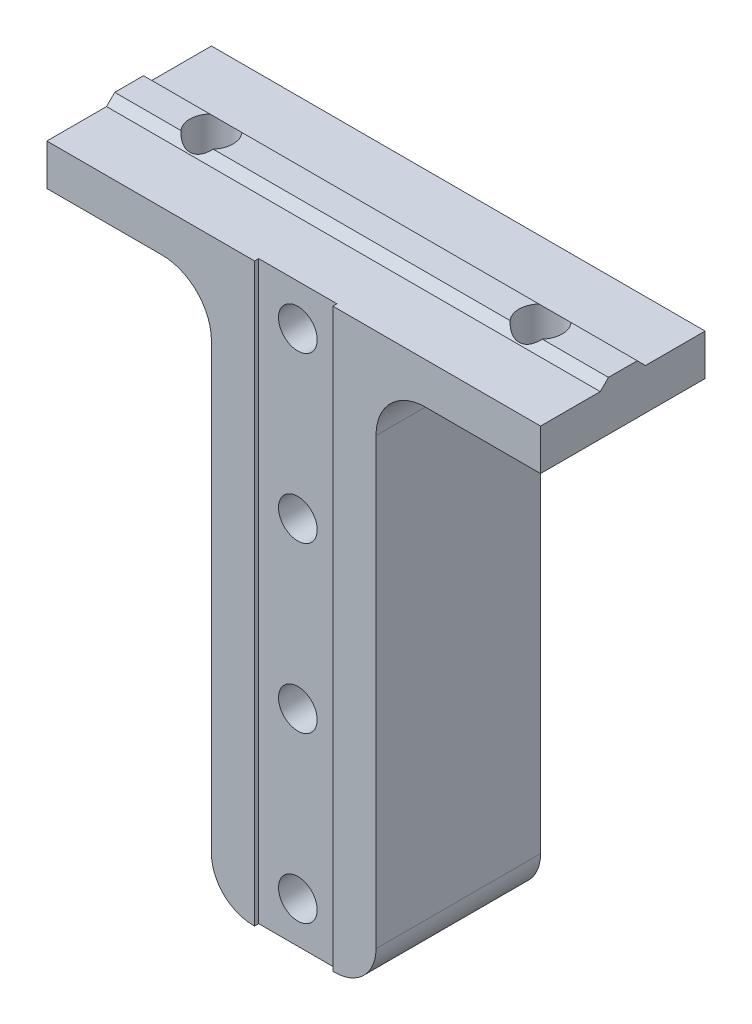
ISO-10303-21;
HEADER;
FILE_DESCRIPTION(('STEP AP214'),'2;1');
FILE_NAME('part.step','',(''),(''),'','','');
FILE_SCHEMA(('AUTOMOTIVE_DESIGN { 1 0 10303 214 1 1 1 1 }'));
ENDSEC;
DATA;
#1=APPLICATION_CONTEXT('core data for automotive mechanical design processes');
#2=APPLICATION_PROTOCOL_DEFINITION('international standard','automotive_design',2000,#1);
#3=PRODUCT_CONTEXT('',#1,'mechanical');
#4=PRODUCT('Part','Part','',(#3));
#5=PRODUCT_RELATED_PRODUCT_CATEGORY('part','',(#4));
#6=PRODUCT_DEFINITION_FORMATION('','',#4);
#7=PRODUCT_DEFINITION_CONTEXT('part definition',#1,'design');
#8=PRODUCT_DEFINITION('design','',#6,#7);
#9=PRODUCT_DEFINITION_SHAPE('','',#8);
#10=(LENGTH_UNIT() NAMED_UNIT(*) SI_UNIT(.MILLI.,.METRE.));
#11=(NAMED_UNIT(*) PLANE_ANGLE_UNIT() SI_UNIT($,.RADIAN.));
#12=(NAMED_UNIT(*) SI_UNIT($,.STERADIAN.) SOLID_ANGLE_UNIT());
#13=UNCERTAINTY_MEASURE_WITH_UNIT(LENGTH_MEASURE(1.E-05),#10,'distance_accuracy_value','');
#14=(GEOMETRIC_REPRESENTATION_CONTEXT(3) GLOBAL_UNCERTAINTY_ASSIGNED_CONTEXT((#13)) GLOBAL_UNIT_ASSIGNED_CONTEXT((#10,
#11,#12)) REPRESENTATION_CONTEXT('',''));
#15=CARTESIAN_POINT('',(0.,0.,0.));
#16=DIRECTION('',(0.,0.,1.));
#17=DIRECTION('',(1.,0.,0.));
#18=AXIS2_PLACEMENT_3D('',#15,#16,#17);
#19=CARTESIAN_POINT('',(0.,44.59375,0.));
#20=DIRECTION('',(0.,1.,0.));
#21=DIRECTION('',(0.,0.,1.));
#22=AXIS2_PLACEMENT_3D('',#19,#20,#21);
#23=PLANE('',#22);
#24=CARTESIAN_POINT('',(19.53125,44.59375,10.));
#25=DIRECTION('',(0.,-1.,0.));
#26=DIRECTION('',(0.,0.,-1.));
#27=AXIS2_PLACEMENT_3D('',#24,#25,#26);
#28=CIRCLE('',#27,2.625);
#29=CARTESIAN_POINT('',(21.4878094803123,44.59375,8.25));
#30=VERTEX_POINT('',#29);
#31=CARTESIAN_POINT('',(21.4878094803123,44.59375,11.75));
#32=VERTEX_POINT('',#31);
#33=EDGE_CURVE('E230',#30,#32,#28,.T.);
#34=ORIENTED_EDGE('',*,*,#33,.T.);
#35=DIRECTION('',(1.,0.,0.));
#36=VECTOR('',#35,1.);
#37=CARTESIAN_POINT('',(29.53125,44.59375,11.75));
#38=LINE('',#37,#36);
#39=CARTESIAN_POINT('',(29.53125,44.59375,11.75));
#40=VERTEX_POINT('',#39);
#41=EDGE_CURVE('E304',#32,#40,#38,.T.);
#42=ORIENTED_EDGE('',*,*,#41,.T.);
#43=DIRECTION('',(0.,0.,-1.));
#44=VECTOR('',#43,1.);
#45=CARTESIAN_POINT('',(29.53125,44.59375,7.25));
#46=LINE('',#45,#44);
#47=CARTESIAN_POINT('',(29.53125,44.59375,8.25));
#48=VERTEX_POINT('',#47);
#49=EDGE_CURVE('E342',#40,#48,#46,.T.);
#50=ORIENTED_EDGE('',*,*,#49,.T.);
#51=DIRECTION('',(-1.,0.,0.));
#52=VECTOR('',#51,1.);
#53=CARTESIAN_POINT('',(-30.46875,44.59375,8.25));
#54=LINE('',#53,#52);
#55=EDGE_CURVE('E235',#48,#30,#54,.T.);
#56=ORIENTED_EDGE('',*,*,#55,.T.);
#57=EDGE_LOOP('',(#34,#42,#50,#56));
#58=FACE_BOUND('',#57,.T.);
#59=ADVANCED_FACE('F46',(#58),#23,.T.);
#60=CARTESIAN_POINT('',(17.5746905196877,44.59375,11.75));
#61=VERTEX_POINT('',#60);
#62=CARTESIAN_POINT('',(17.5746905196877,44.59375,8.25));
#63=VERTEX_POINT('',#62);
#64=EDGE_CURVE('E234',#61,#63,#28,.T.);
#65=ORIENTED_EDGE('',*,*,#64,.T.);
#66=CARTESIAN_POINT('',(-18.5121905196877,44.59375,8.25));
#67=VERTEX_POINT('',#66);
#68=EDGE_CURVE('E226',#63,#67,#54,.T.);
#69=ORIENTED_EDGE('',*,*,#68,.T.);
#70=CARTESIAN_POINT('',(-20.46875,44.59375,10.));
#71=DIRECTION('',(0.,-1.,0.));
#72=DIRECTION('',(0.,0.,-1.));
#73=AXIS2_PLACEMENT_3D('',#70,#71,#72);
#74=CIRCLE('',#73,2.625);
#75=CARTESIAN_POINT('',(-18.5121905196877,44.59375,11.75));
#76=VERTEX_POINT('',#75);
#77=EDGE_CURVE('E206',#67,#76,#74,.T.);
#78=ORIENTED_EDGE('',*,*,#77,.T.);
#79=EDGE_CURVE('E310',#76,#61,#38,.T.);
#80=ORIENTED_EDGE('',*,*,#79,.T.);
#81=EDGE_LOOP('',(#65,#69,#78,#80));
#82=FACE_BOUND('',#81,.T.);
#83=ADVANCED_FACE('F233',(#82),#23,.T.);
#84=CARTESIAN_POINT('',(-10.46875,43.59375,20.));
#85=DIRECTION('',(0.,-1.,0.));
#86=DIRECTION('',(0.,0.,-1.));
#87=AXIS2_PLACEMENT_3D('',#84,#85,#86);
#88=PLANE('',#87);
#89=DIRECTION('',(-1.,0.,0.));
#90=VECTOR('',#89,1.);
#91=CARTESIAN_POINT('',(-30.46875,43.59375,7.25));
#92=LINE('',#91,#90);
#93=CARTESIAN_POINT('',(29.53125,43.59375,7.25));
#94=VERTEX_POINT('',#93);
#95=CARTESIAN_POINT('',(-30.46875,43.59375,7.25));
#96=VERTEX_POINT('',#95);
#97=EDGE_CURVE('E343',#94,#96,#92,.T.);
#98=ORIENTED_EDGE('',*,*,#97,.F.);
#99=DIRECTION('',(0.,0.,-1.));
#100=VECTOR('',#99,1.);
#101=CARTESIAN_POINT('',(29.53125,43.59375,0.));
#102=LINE('',#101,#100);
#103=CARTESIAN_POINT('',(29.53125,43.59375,0.));
#104=VERTEX_POINT('',#103);
#105=EDGE_CURVE('E358',#94,#104,#102,.T.);
#106=ORIENTED_EDGE('',*,*,#105,.T.);
#107=DIRECTION('',(-1.,0.,0.));
#108=VECTOR('',#107,1.);
#109=CARTESIAN_POINT('',(-10.46875,43.59375,0.));
#110=LINE('',#109,#108);
#111=CARTESIAN_POINT('',(-30.46875,43.59375,0.));
#112=VERTEX_POINT('',#111);
#113=EDGE_CURVE('E280',#104,#112,#110,.T.);
#114=ORIENTED_EDGE('',*,*,#113,.T.);
#115=DIRECTION('',(0.,0.,1.));
#116=VECTOR('',#115,1.);
#117=CARTESIAN_POINT('',(-30.46875,43.59375,0.));
#118=LINE('',#117,#116);
#119=EDGE_CURVE('E355',#112,#96,#118,.T.);
#120=ORIENTED_EDGE('',*,*,#119,.T.);
#121=EDGE_LOOP('',(#98,#106,#114,#120));
#122=FACE_BOUND('',#121,.T.);
#123=ADVANCED_FACE('F481',(#122),#88,.F.);
#124=DIRECTION('',(1.,0.,0.));
#125=VECTOR('',#124,1.);
#126=CARTESIAN_POINT('',(-30.46875,43.59375,12.75));
#127=LINE('',#126,#125);
#128=CARTESIAN_POINT('',(-30.46875,43.59375,12.75));
#129=VERTEX_POINT('',#128);
#130=CARTESIAN_POINT('',(29.53125,43.59375,12.75));
#131=VERTEX_POINT('',#130);
#132=EDGE_CURVE('E340',#129,#131,#127,.T.);
#133=ORIENTED_EDGE('',*,*,#132,.F.);
#134=CARTESIAN_POINT('',(-30.46875,43.59375,20.));
#135=VERTEX_POINT('',#134);
#136=EDGE_CURVE('E359',#129,#135,#118,.T.);
#137=ORIENTED_EDGE('',*,*,#136,.T.);
#138=DIRECTION('',(-1.,0.,0.));
#139=VECTOR('',#138,1.);
#140=CARTESIAN_POINT('',(-10.46875,43.59375,20.));
#141=LINE('',#140,#139);
#142=CARTESIAN_POINT('',(-5.21875,43.59375,20.));
#143=VERTEX_POINT('',#142);
#144=EDGE_CURVE('E438',#143,#135,#141,.T.);
#145=ORIENTED_EDGE('',*,*,#144,.F.);
#146=DIRECTION('',(0.,0.,1.));
#147=VECTOR('',#146,1.);
#148=CARTESIAN_POINT('',(-5.21875,43.59375,19.5));
#149=LINE('',#148,#147);
#150=CARTESIAN_POINT('',(-5.21875,43.59375,19.5));
#151=VERTEX_POINT('',#150);
#152=EDGE_CURVE('E424',#151,#143,#149,.T.);
#153=ORIENTED_EDGE('',*,*,#152,.F.);
#154=DIRECTION('',(-1.,0.,0.));
#155=VECTOR('',#154,1.);
#156=CARTESIAN_POINT('',(-5.21875,43.59375,19.5));
#157=LINE('',#156,#155);
#158=CARTESIAN_POINT('',(4.28125,43.59375,19.5));
#159=VERTEX_POINT('',#158);
#160=EDGE_CURVE('E417',#159,#151,#157,.T.);
#161=ORIENTED_EDGE('',*,*,#160,.F.);
#162=DIRECTION('',(0.,0.,1.));
#163=VECTOR('',#162,1.);
#164=CARTESIAN_POINT('',(4.28125,43.59375,19.5));
#165=LINE('',#164,#163);
#166=CARTESIAN_POINT('',(4.28125,43.59375,20.));
#167=VERTEX_POINT('',#166);
#168=EDGE_CURVE('E426',#159,#167,#165,.T.);
#169=ORIENTED_EDGE('',*,*,#168,.T.);
#170=CARTESIAN_POINT('',(29.53125,43.59375,20.));
#171=VERTEX_POINT('',#170);
#172=EDGE_CURVE('E292',#171,#167,#141,.T.);
#173=ORIENTED_EDGE('',*,*,#172,.F.);
#174=EDGE_CURVE('E369',#171,#131,#102,.T.);
#175=ORIENTED_EDGE('',*,*,#174,.T.);
#176=EDGE_LOOP('',(#133,#137,#145,#153,#161,#169,#173,#175));
#177=FACE_BOUND('',#176,.T.);
#178=ADVANCED_FACE('F464',(#177),#88,.F.);
#179=CARTESIAN_POINT('',(0.,0.,20.));
#180=DIRECTION('',(0.,0.,1.));
#181=DIRECTION('',(1.,0.,0.));
#182=AXIS2_PLACEMENT_3D('',#179,#180,#181);
#183=PLANE('',#182);
#184=DIRECTION('',(0.,-1.,0.));
#185=VECTOR('',#184,1.);
#186=CARTESIAN_POINT('',(-10.46875,43.59375,20.));
#187=LINE('',#186,#185);
#188=CARTESIAN_POINT('',(-10.46875,32.59375,20.));
#189=VERTEX_POINT('',#188);
#190=CARTESIAN_POINT('',(-10.46875,-21.40625,20.));
#191=VERTEX_POINT('',#190);
#192=EDGE_CURVE('E283',#189,#191,#187,.T.);
#193=ORIENTED_EDGE('',*,*,#192,.T.);
#194=CARTESIAN_POINT('',(-5.46875,-21.40625,20.));
#195=DIRECTION('',(0.,0.,1.));
#196=DIRECTION('',(1.,0.,0.));
#197=AXIS2_PLACEMENT_3D('',#194,#195,#196);
#198=CIRCLE('',#197,5.);
#199=CARTESIAN_POINT('',(-5.46875,-26.40625,20.));
#200=VERTEX_POINT('',#199);
#201=EDGE_CURVE('E260',#191,#200,#198,.T.);
#202=ORIENTED_EDGE('',*,*,#201,.T.);
#203=DIRECTION('',(1.,0.,0.));
#204=VECTOR('',#203,1.);
#205=CARTESIAN_POINT('',(-10.46875,-26.40625,20.));
#206=LINE('',#205,#204);
#207=CARTESIAN_POINT('',(-5.21874999999999,-26.40625,20.));
#208=VERTEX_POINT('',#207);
#209=EDGE_CURVE('E435',#200,#208,#206,.T.);
#210=ORIENTED_EDGE('',*,*,#209,.T.);
#211=DIRECTION('',(0.,-1.,0.));
#212=VECTOR('',#211,1.);
#213=CARTESIAN_POINT('',(-5.21875,43.59375,20.));
#214=LINE('',#213,#212);
#215=EDGE_CURVE('E404',#143,#208,#214,.T.);
#216=ORIENTED_EDGE('',*,*,#215,.F.);
#217=ORIENTED_EDGE('',*,*,#144,.T.);
#218=DIRECTION('',(0.,1.,0.));
#219=VECTOR('',#218,1.);
#220=CARTESIAN_POINT('',(-30.46875,38.59375,20.));
#221=LINE('',#220,#219);
#222=CARTESIAN_POINT('',(-30.46875,38.59375,20.));
#223=VERTEX_POINT('',#222);
#224=EDGE_CURVE('E345',#223,#135,#221,.T.);
#225=ORIENTED_EDGE('',*,*,#224,.F.);
#226=DIRECTION('',(1.,0.,0.));
#227=VECTOR('',#226,1.);
#228=CARTESIAN_POINT('',(-10.46875,38.59375,20.));
#229=LINE('',#228,#227);
#230=CARTESIAN_POINT('',(-16.46875,38.59375,20.));
#231=VERTEX_POINT('',#230);
#232=EDGE_CURVE('E352',#223,#231,#229,.T.);
#233=ORIENTED_EDGE('',*,*,#232,.T.);
#234=CARTESIAN_POINT('',(-16.46875,32.59375,20.));
#235=DIRECTION('',(0.,0.,1.));
#236=DIRECTION('',(1.,0.,0.));
#237=AXIS2_PLACEMENT_3D('',#234,#235,#236);
#238=CIRCLE('',#237,6.);
#239=EDGE_CURVE('E303',#231,#189,#238,.F.);
#240=ORIENTED_EDGE('',*,*,#239,.T.);
#241=EDGE_LOOP('',(#193,#202,#210,#216,#217,#225,#233,#240));
#242=FACE_BOUND('',#241,.T.);
#243=ADVANCED_FACE('F451',(#242),#183,.T.);
#244=CARTESIAN_POINT('',(-10.46875,43.59375,20.));
#245=DIRECTION('',(1.,0.,0.));
#246=DIRECTION('',(0.,1.,0.));
#247=AXIS2_PLACEMENT_3D('',#244,#245,#246);
#248=PLANE('',#247);
#249=DIRECTION('',(0.,-1.,0.));
#250=VECTOR('',#249,1.);
#251=CARTESIAN_POINT('',(-10.46875,43.59375,0.));
#252=LINE('',#251,#250);
#253=CARTESIAN_POINT('',(-10.46875,32.59375,0.));
#254=VERTEX_POINT('',#253);
#255=CARTESIAN_POINT('',(-10.46875,-21.40625,0.));
#256=VERTEX_POINT('',#255);
#257=EDGE_CURVE('E285',#254,#256,#252,.T.);
#258=ORIENTED_EDGE('',*,*,#257,.T.);
#259=DIRECTION('',(0.,0.,-1.));
#260=VECTOR('',#259,1.);
#261=CARTESIAN_POINT('',(-10.46875,-21.40625,20.));
#262=LINE('',#261,#260);
#263=EDGE_CURVE('E258',#256,#191,#262,.F.);
#264=ORIENTED_EDGE('',*,*,#263,.T.);
#265=ORIENTED_EDGE('',*,*,#192,.F.);
#266=DIRECTION('',(0.,0.,-1.));
#267=VECTOR('',#266,1.);
#268=CARTESIAN_POINT('',(-10.46875,32.59375,20.));
#269=LINE('',#268,#267);
#270=EDGE_CURVE('E297',#189,#254,#269,.T.);
#271=ORIENTED_EDGE('',*,*,#270,.T.);
#272=EDGE_LOOP('',(#258,#264,#265,#271));
#273=FACE_BOUND('',#272,.T.);
#274=ADVANCED_FACE('F444',(#273),#248,.F.);
#275=CARTESIAN_POINT('',(-10.46875,-26.40625,20.));
#276=DIRECTION('',(0.,1.,0.));
#277=DIRECTION('',(0.,0.,1.));
#278=AXIS2_PLACEMENT_3D('',#275,#276,#277);
#279=PLANE('',#278);
#280=DIRECTION('',(1.,0.,0.));
#281=VECTOR('',#280,1.);
#282=CARTESIAN_POINT('',(-10.46875,-26.40625,0.));
#283=LINE('',#282,#281);
#284=CARTESIAN_POINT('',(-5.46875,-26.40625,0.));
#285=VERTEX_POINT('',#284);
#286=CARTESIAN_POINT('',(4.53125,-26.40625,0.));
#287=VERTEX_POINT('',#286);
#288=EDGE_CURVE('E281',#285,#287,#283,.T.);
#289=ORIENTED_EDGE('',*,*,#288,.T.);
#290=DIRECTION('',(0.,0.,-1.));
#291=VECTOR('',#290,1.);
#292=CARTESIAN_POINT('',(4.53125,-26.40625,20.));
#293=LINE('',#292,#291);
#294=CARTESIAN_POINT('',(4.53125,-26.40625,20.));
#295=VERTEX_POINT('',#294);
#296=EDGE_CURVE('E54',#287,#295,#293,.F.);
#297=ORIENTED_EDGE('',*,*,#296,.T.);
#298=CARTESIAN_POINT('',(4.28125000000001,-26.40625,20.));
#299=VERTEX_POINT('',#298);
#300=EDGE_CURVE('E434',#299,#295,#206,.T.);
#301=ORIENTED_EDGE('',*,*,#300,.F.);
#302=DIRECTION('',(0.,0.,1.));
#303=VECTOR('',#302,1.);
#304=CARTESIAN_POINT('',(4.28125000000001,-26.40625,19.5));
#305=LINE('',#304,#303);
#306=CARTESIAN_POINT('',(4.28125000000001,-26.40625,19.5));
#307=VERTEX_POINT('',#306);
#308=EDGE_CURVE('E429',#307,#299,#305,.T.);
#309=ORIENTED_EDGE('',*,*,#308,.F.);
#310=DIRECTION('',(1.,0.,0.));
#311=VECTOR('',#310,1.);
#312=CARTESIAN_POINT('',(-5.21874999999999,-26.40625,19.5));
#313=LINE('',#312,#311);
#314=CARTESIAN_POINT('',(-5.21874999999999,-26.40625,19.5));
#315=VERTEX_POINT('',#314);
#316=EDGE_CURVE('E410',#315,#307,#313,.T.);
#317=ORIENTED_EDGE('',*,*,#316,.F.);
#318=DIRECTION('',(0.,0.,1.));
#319=VECTOR('',#318,1.);
#320=CARTESIAN_POINT('',(-5.21874999999999,-26.40625,19.5));
#321=LINE('',#320,#319);
#322=EDGE_CURVE('E420',#315,#208,#321,.T.);
#323=ORIENTED_EDGE('',*,*,#322,.T.);
#324=ORIENTED_EDGE('',*,*,#209,.F.);
#325=DIRECTION('',(0.,0.,-1.));
#326=VECTOR('',#325,1.);
#327=CARTESIAN_POINT('',(-5.46875,-26.40625,20.));
#328=LINE('',#327,#326);
#329=EDGE_CURVE('E253',#200,#285,#328,.T.);
#330=ORIENTED_EDGE('',*,*,#329,.T.);
#331=EDGE_LOOP('',(#289,#297,#301,#309,#317,#323,#324,#330));
#332=FACE_BOUND('',#331,.T.);
#333=ADVANCED_FACE('F453',(#332),#279,.F.);
#334=CARTESIAN_POINT('',(9.53125,43.59375,20.));
#335=DIRECTION('',(-1.,0.,0.));
#336=DIRECTION('',(0.,-1.,0.));
#337=AXIS2_PLACEMENT_3D('',#334,#335,#336);
#338=PLANE('',#337);
#339=DIRECTION('',(0.,1.,0.));
#340=VECTOR('',#339,1.);
#341=CARTESIAN_POINT('',(9.53125,43.59375,20.));
#342=LINE('',#341,#340);
#343=CARTESIAN_POINT('',(9.53125000000001,-21.40625,20.));
#344=VERTEX_POINT('',#343);
#345=CARTESIAN_POINT('',(9.53125,32.59375,20.));
#346=VERTEX_POINT('',#345);
#347=EDGE_CURVE('E272',#344,#346,#342,.T.);
#348=ORIENTED_EDGE('',*,*,#347,.F.);
#349=DIRECTION('',(0.,0.,-1.));
#350=VECTOR('',#349,1.);
#351=CARTESIAN_POINT('',(9.53125000000001,-21.40625,20.));
#352=LINE('',#351,#350);
#353=CARTESIAN_POINT('',(9.53125000000001,-21.40625,0.));
#354=VERTEX_POINT('',#353);
#355=EDGE_CURVE('E262',#344,#354,#352,.T.);
#356=ORIENTED_EDGE('',*,*,#355,.T.);
#357=DIRECTION('',(0.,1.,0.));
#358=VECTOR('',#357,1.);
#359=CARTESIAN_POINT('',(9.53125,43.59375,0.));
#360=LINE('',#359,#358);
#361=CARTESIAN_POINT('',(9.53125,32.59375,0.));
#362=VERTEX_POINT('',#361);
#363=EDGE_CURVE('E270',#354,#362,#360,.T.);
#364=ORIENTED_EDGE('',*,*,#363,.T.);
#365=DIRECTION('',(0.,0.,1.));
#366=VECTOR('',#365,1.);
#367=CARTESIAN_POINT('',(9.53125,32.59375,20.));
#368=LINE('',#367,#366);
#369=EDGE_CURVE('E289',#362,#346,#368,.T.);
#370=ORIENTED_EDGE('',*,*,#369,.T.);
#371=EDGE_LOOP('',(#348,#356,#364,#370));
#372=FACE_BOUND('',#371,.T.);
#373=ADVANCED_FACE('F268',(#372),#338,.F.);
#374=ORIENTED_EDGE('',*,*,#300,.T.);
#375=CARTESIAN_POINT('',(4.53125,-21.40625,20.));
#376=DIRECTION('',(0.,0.,1.));
#377=DIRECTION('',(1.,0.,0.));
#378=AXIS2_PLACEMENT_3D('',#375,#376,#377);
#379=CIRCLE('',#378,5.);
#380=EDGE_CURVE('E11',#295,#344,#379,.T.);
#381=ORIENTED_EDGE('',*,*,#380,.T.);
#382=ORIENTED_EDGE('',*,*,#347,.T.);
#383=CARTESIAN_POINT('',(15.53125,32.59375,20.));
#384=DIRECTION('',(0.,0.,1.));
#385=DIRECTION('',(1.,0.,0.));
#386=AXIS2_PLACEMENT_3D('',#383,#384,#385);
#387=CIRCLE('',#386,6.);
#388=CARTESIAN_POINT('',(15.53125,38.59375,20.));
#389=VERTEX_POINT('',#388);
#390=EDGE_CURVE('E294',#346,#389,#387,.F.);
#391=ORIENTED_EDGE('',*,*,#390,.T.);
#392=DIRECTION('',(1.,0.,0.));
#393=VECTOR('',#392,1.);
#394=CARTESIAN_POINT('',(9.53125,38.59375,20.));
#395=LINE('',#394,#393);
#396=CARTESIAN_POINT('',(29.53125,38.59375,20.));
#397=VERTEX_POINT('',#396);
#398=EDGE_CURVE('E366',#389,#397,#395,.T.);
#399=ORIENTED_EDGE('',*,*,#398,.T.);
#400=DIRECTION('',(0.,1.,0.));
#401=VECTOR('',#400,1.);
#402=CARTESIAN_POINT('',(29.53125,38.59375,20.));
#403=LINE('',#402,#401);
#404=EDGE_CURVE('E374',#397,#171,#403,.T.);
#405=ORIENTED_EDGE('',*,*,#404,.T.);
#406=ORIENTED_EDGE('',*,*,#172,.T.);
#407=DIRECTION('',(0.,1.,0.));
#408=VECTOR('',#407,1.);
#409=CARTESIAN_POINT('',(4.28125,43.59375,20.));
#410=LINE('',#409,#408);
#411=EDGE_CURVE('E411',#299,#167,#410,.T.);
#412=ORIENTED_EDGE('',*,*,#411,.F.);
#413=EDGE_LOOP('',(#374,#381,#382,#391,#399,#405,#406,#412));
#414=FACE_BOUND('',#413,.T.);
#415=ADVANCED_FACE('F497',(#414),#183,.T.);
#416=CARTESIAN_POINT('',(0.,0.,0.));
#417=DIRECTION('',(0.,0.,1.));
#418=DIRECTION('',(1.,0.,0.));
#419=AXIS2_PLACEMENT_3D('',#416,#417,#418);
#420=PLANE('',#419);
#421=ORIENTED_EDGE('',*,*,#363,.F.);
#422=CARTESIAN_POINT('',(4.53125,-21.40625,0.));
#423=DIRECTION('',(0.,0.,1.));
#424=DIRECTION('',(1.,0.,0.));
#425=AXIS2_PLACEMENT_3D('',#422,#423,#424);
#426=CIRCLE('',#425,5.);
#427=EDGE_CURVE('E68',#354,#287,#426,.F.);
#428=ORIENTED_EDGE('',*,*,#427,.T.);
#429=ORIENTED_EDGE('',*,*,#288,.F.);
#430=CARTESIAN_POINT('',(-5.46875,-21.40625,0.));
#431=DIRECTION('',(0.,0.,1.));
#432=DIRECTION('',(1.,0.,0.));
#433=AXIS2_PLACEMENT_3D('',#430,#431,#432);
#434=CIRCLE('',#433,5.);
#435=EDGE_CURVE('E256',#285,#256,#434,.F.);
#436=ORIENTED_EDGE('',*,*,#435,.T.);
#437=ORIENTED_EDGE('',*,*,#257,.F.);
#438=CARTESIAN_POINT('',(-16.46875,32.59375,0.));
#439=DIRECTION('',(0.,0.,1.));
#440=DIRECTION('',(1.,0.,0.));
#441=AXIS2_PLACEMENT_3D('',#438,#439,#440);
#442=CIRCLE('',#441,6.);
#443=CARTESIAN_POINT('',(-16.46875,38.59375,0.));
#444=VERTEX_POINT('',#443);
#445=EDGE_CURVE('E302',#254,#444,#442,.T.);
#446=ORIENTED_EDGE('',*,*,#445,.T.);
#447=DIRECTION('',(-1.,0.,0.));
#448=VECTOR('',#447,1.);
#449=CARTESIAN_POINT('',(-10.46875,38.59375,0.));
#450=LINE('',#449,#448);
#451=CARTESIAN_POINT('',(-30.46875,38.59375,0.));
#452=VERTEX_POINT('',#451);
#453=EDGE_CURVE('E364',#444,#452,#450,.T.);
#454=ORIENTED_EDGE('',*,*,#453,.T.);
#455=DIRECTION('',(0.,1.,0.));
#456=VECTOR('',#455,1.);
#457=CARTESIAN_POINT('',(-30.46875,38.59375,0.));
#458=LINE('',#457,#456);
#459=EDGE_CURVE('E349',#452,#112,#458,.T.);
#460=ORIENTED_EDGE('',*,*,#459,.T.);
#461=ORIENTED_EDGE('',*,*,#113,.F.);
#462=DIRECTION('',(0.,1.,0.));
#463=VECTOR('',#462,1.);
#464=CARTESIAN_POINT('',(29.53125,38.59375,0.));
#465=LINE('',#464,#463);
#466=CARTESIAN_POINT('',(29.53125,38.59375,0.));
#467=VERTEX_POINT('',#466);
#468=EDGE_CURVE('E377',#467,#104,#465,.T.);
#469=ORIENTED_EDGE('',*,*,#468,.F.);
#470=DIRECTION('',(-1.,0.,0.));
#471=VECTOR('',#470,1.);
#472=CARTESIAN_POINT('',(9.53125,38.59375,0.));
#473=LINE('',#472,#471);
#474=CARTESIAN_POINT('',(15.53125,38.59375,0.));
#475=VERTEX_POINT('',#474);
#476=EDGE_CURVE('E372',#467,#475,#473,.T.);
#477=ORIENTED_EDGE('',*,*,#476,.T.);
#478=CARTESIAN_POINT('',(15.53125,32.59375,0.));
#479=DIRECTION('',(0.,0.,1.));
#480=DIRECTION('',(1.,0.,0.));
#481=AXIS2_PLACEMENT_3D('',#478,#479,#480);
#482=CIRCLE('',#481,6.);
#483=EDGE_CURVE('E278',#475,#362,#482,.T.);
#484=ORIENTED_EDGE('',*,*,#483,.T.);
#485=EDGE_LOOP('',(#421,#428,#429,#436,#437,#446,#454,#460,#461,#469,#477,#484));
#486=FACE_BOUND('',#485,.T.);
#487=ADVANCED_FACE('F275',(#486),#420,.F.);
#488=CARTESIAN_POINT('',(-5.21875,43.59375,19.5));
#489=DIRECTION('',(-1.,0.,0.));
#490=DIRECTION('',(0.,-1.,0.));
#491=AXIS2_PLACEMENT_3D('',#488,#489,#490);
#492=PLANE('',#491);
#493=ORIENTED_EDGE('',*,*,#215,.T.);
#494=ORIENTED_EDGE('',*,*,#322,.F.);
#495=DIRECTION('',(0.,-1.,0.));
#496=VECTOR('',#495,1.);
#497=CARTESIAN_POINT('',(-5.21875,43.59375,19.5));
#498=LINE('',#497,#496);
#499=EDGE_CURVE('E407',#151,#315,#498,.T.);
#500=ORIENTED_EDGE('',*,*,#499,.F.);
#501=ORIENTED_EDGE('',*,*,#152,.T.);
#502=EDGE_LOOP('',(#493,#494,#500,#501));
#503=FACE_BOUND('',#502,.T.);
#504=ADVANCED_FACE('F457',(#503),#492,.F.);
#505=CARTESIAN_POINT('',(4.28125,43.59375,19.5));
#506=DIRECTION('',(1.,0.,0.));
#507=DIRECTION('',(0.,1.,0.));
#508=AXIS2_PLACEMENT_3D('',#505,#506,#507);
#509=PLANE('',#508);
#510=ORIENTED_EDGE('',*,*,#411,.T.);
#511=ORIENTED_EDGE('',*,*,#168,.F.);
#512=DIRECTION('',(0.,1.,0.));
#513=VECTOR('',#512,1.);
#514=CARTESIAN_POINT('',(4.28125,43.59375,19.5));
#515=LINE('',#514,#513);
#516=EDGE_CURVE('E414',#307,#159,#515,.T.);
#517=ORIENTED_EDGE('',*,*,#516,.F.);
#518=ORIENTED_EDGE('',*,*,#308,.T.);
#519=EDGE_LOOP('',(#510,#511,#517,#518));
#520=FACE_BOUND('',#519,.T.);
#521=ADVANCED_FACE('F686',(#520),#509,.F.);
#522=CARTESIAN_POINT('',(0.,0.,19.5));
#523=DIRECTION('',(0.,0.,1.));
#524=DIRECTION('',(1.,0.,0.));
#525=AXIS2_PLACEMENT_3D('',#522,#523,#524);
#526=PLANE('',#525);
#527=CARTESIAN_POINT('',(-0.468750000000002,18.59375,19.5));
#528=DIRECTION('',(0.,0.,1.));
#529=DIRECTION('',(1.,0.,0.));
#530=AXIS2_PLACEMENT_3D('',#527,#528,#529);
#531=CIRCLE('',#530,2.35);
#532=CARTESIAN_POINT('',(1.88125,18.59375,19.5));
#533=VERTEX_POINT('',#532);
#534=EDGE_CURVE('E389',#533,#533,#531,.T.);
#535=ORIENTED_EDGE('',*,*,#534,.F.);
#536=EDGE_LOOP('',(#535));
#537=FACE_BOUND('',#536,.T.);
#538=CARTESIAN_POINT('',(-0.468750000000002,-1.40624999999996,19.5));
#539=DIRECTION('',(0.,0.,1.));
#540=DIRECTION('',(1.,0.,0.));
#541=AXIS2_PLACEMENT_3D('',#538,#539,#540);
#542=CIRCLE('',#541,2.35);
#543=CARTESIAN_POINT('',(1.88125,-1.40624999999996,19.5));
#544=VERTEX_POINT('',#543);
#545=EDGE_CURVE('E396',#544,#544,#542,.T.);
#546=ORIENTED_EDGE('',*,*,#545,.F.);
#547=EDGE_LOOP('',(#546));
#548=FACE_BOUND('',#547,.T.);
#549=CARTESIAN_POINT('',(-0.468750000000002,-21.40625,19.5));
#550=DIRECTION('',(0.,0.,1.));
#551=DIRECTION('',(1.,0.,0.));
#552=AXIS2_PLACEMENT_3D('',#549,#550,#551);
#553=CIRCLE('',#552,2.35);
#554=CARTESIAN_POINT('',(1.88125,-21.40625,19.5));
#555=VERTEX_POINT('',#554);
#556=EDGE_CURVE('E383',#555,#555,#553,.T.);
#557=ORIENTED_EDGE('',*,*,#556,.F.);
#558=EDGE_LOOP('',(#557));
#559=FACE_BOUND('',#558,.T.);
#560=CARTESIAN_POINT('',(-0.468750000000006,38.59375,19.5));
#561=DIRECTION('',(0.,0.,1.));
#562=DIRECTION('',(1.,0.,0.));
#563=AXIS2_PLACEMENT_3D('',#560,#561,#562);
#564=CIRCLE('',#563,2.35);
#565=CARTESIAN_POINT('',(1.88124999999999,38.59375,19.5));
#566=VERTEX_POINT('',#565);
#567=EDGE_CURVE('E392',#566,#566,#564,.T.);
#568=ORIENTED_EDGE('',*,*,#567,.F.);
#569=EDGE_LOOP('',(#568));
#570=FACE_BOUND('',#569,.T.);
#571=ORIENTED_EDGE('',*,*,#499,.T.);
#572=ORIENTED_EDGE('',*,*,#316,.T.);
#573=ORIENTED_EDGE('',*,*,#516,.T.);
#574=ORIENTED_EDGE('',*,*,#160,.T.);
#575=EDGE_LOOP('',(#571,#572,#573,#574));
#576=FACE_BOUND('',#575,.T.);
#577=ADVANCED_FACE('F459',(#537,#548,#559,#570,#576),#526,.T.);
#578=CARTESIAN_POINT('',(-0.468750000000006,38.59375,14.));
#579=DIRECTION('',(0.,0.,1.));
#580=DIRECTION('',(1.,0.,0.));
#581=AXIS2_PLACEMENT_3D('',#578,#579,#580);
#582=CYLINDRICAL_SURFACE('',#581,2.35);
#583=CARTESIAN_POINT('',(-0.468750000000006,38.59375,14.));
#584=DIRECTION('',(0.,0.,1.));
#585=DIRECTION('',(1.,0.,0.));
#586=AXIS2_PLACEMENT_3D('',#583,#584,#585);
#587=CIRCLE('',#586,2.35);
#588=CARTESIAN_POINT('',(1.88124999999999,38.59375,14.));
#589=VERTEX_POINT('',#588);
#590=EDGE_CURVE('E401',#589,#589,#587,.T.);
#591=ORIENTED_EDGE('',*,*,#590,.F.);
#592=EDGE_LOOP('',(#591));
#593=FACE_BOUND('',#592,.T.);
#594=ORIENTED_EDGE('',*,*,#567,.T.);
#595=EDGE_LOOP('',(#594));
#596=FACE_BOUND('',#595,.T.);
#597=ADVANCED_FACE('F667',(#593,#596),#582,.F.);
#598=CARTESIAN_POINT('',(-0.468750000000006,38.59375,14.));
#599=DIRECTION('',(0.,0.,1.));
#600=DIRECTION('',(1.,0.,0.));
#601=AXIS2_PLACEMENT_3D('',#598,#599,#600);
#602=PLANE('',#601);
#603=ORIENTED_EDGE('',*,*,#590,.T.);
#604=EDGE_LOOP('',(#603));
#605=FACE_BOUND('',#604,.T.);
#606=ADVANCED_FACE('F657',(#605),#602,.T.);
#607=CARTESIAN_POINT('',(-0.468750000000002,-21.40625,14.));
#608=DIRECTION('',(0.,0.,1.));
#609=DIRECTION('',(1.,0.,0.));
#610=AXIS2_PLACEMENT_3D('',#607,#608,#609);
#611=CYLINDRICAL_SURFACE('',#610,2.35);
#612=CARTESIAN_POINT('',(-0.468750000000002,-21.40625,14.));
#613=DIRECTION('',(0.,0.,1.));
#614=DIRECTION('',(1.,0.,0.));
#615=AXIS2_PLACEMENT_3D('',#612,#613,#614);
#616=CIRCLE('',#615,2.35);
#617=CARTESIAN_POINT('',(1.88125,-21.40625,14.));
#618=VERTEX_POINT('',#617);
#619=EDGE_CURVE('E380',#618,#618,#616,.T.);
#620=ORIENTED_EDGE('',*,*,#619,.F.);
#621=EDGE_LOOP('',(#620));
#622=FACE_BOUND('',#621,.T.);
#623=ORIENTED_EDGE('',*,*,#556,.T.);
#624=EDGE_LOOP('',(#623));
#625=FACE_BOUND('',#624,.T.);
#626=ADVANCED_FACE('F647',(#622,#625),#611,.F.);
#627=CARTESIAN_POINT('',(-0.468750000000002,-21.40625,14.));
#628=DIRECTION('',(0.,0.,1.));
#629=DIRECTION('',(1.,0.,0.));
#630=AXIS2_PLACEMENT_3D('',#627,#628,#629);
#631=PLANE('',#630);
#632=ORIENTED_EDGE('',*,*,#619,.T.);
#633=EDGE_LOOP('',(#632));
#634=FACE_BOUND('',#633,.T.);
#635=ADVANCED_FACE('F637',(#634),#631,.T.);
#636=CARTESIAN_POINT('',(-0.468750000000002,-1.40624999999996,14.));
#637=DIRECTION('',(0.,0.,1.));
#638=DIRECTION('',(1.,0.,0.));
#639=AXIS2_PLACEMENT_3D('',#636,#637,#638);
#640=CYLINDRICAL_SURFACE('',#639,2.35);
#641=CARTESIAN_POINT('',(-0.468750000000002,-1.40624999999996,14.));
#642=DIRECTION('',(0.,0.,1.));
#643=DIRECTION('',(1.,0.,0.));
#644=AXIS2_PLACEMENT_3D('',#641,#642,#643);
#645=CIRCLE('',#644,2.35);
#646=CARTESIAN_POINT('',(1.88125,-1.40624999999996,14.));
#647=VERTEX_POINT('',#646);
#648=EDGE_CURVE('E386',#647,#647,#645,.T.);
#649=ORIENTED_EDGE('',*,*,#648,.F.);
#650=EDGE_LOOP('',(#649));
#651=FACE_BOUND('',#650,.T.);
#652=ORIENTED_EDGE('',*,*,#545,.T.);
#653=EDGE_LOOP('',(#652));
#654=FACE_BOUND('',#653,.T.);
#655=ADVANCED_FACE('F627',(#651,#654),#640,.F.);
#656=CARTESIAN_POINT('',(-0.468750000000002,-1.40624999999996,14.));
#657=DIRECTION('',(0.,0.,1.));
#658=DIRECTION('',(1.,0.,0.));
#659=AXIS2_PLACEMENT_3D('',#656,#657,#658);
#660=PLANE('',#659);
#661=ORIENTED_EDGE('',*,*,#648,.T.);
#662=EDGE_LOOP('',(#661));
#663=FACE_BOUND('',#662,.T.);
#664=ADVANCED_FACE('F617',(#663),#660,.T.);
#665=CARTESIAN_POINT('',(-0.468750000000002,18.59375,14.));
#666=DIRECTION('',(0.,0.,1.));
#667=DIRECTION('',(1.,0.,0.));
#668=AXIS2_PLACEMENT_3D('',#665,#666,#667);
#669=CYLINDRICAL_SURFACE('',#668,2.35);
#670=CARTESIAN_POINT('',(-0.468750000000002,18.59375,14.));
#671=DIRECTION('',(0.,0.,1.));
#672=DIRECTION('',(1.,0.,0.));
#673=AXIS2_PLACEMENT_3D('',#670,#671,#672);
#674=CIRCLE('',#673,2.35);
#675=CARTESIAN_POINT('',(1.88125,18.59375,14.));
#676=VERTEX_POINT('',#675);
#677=EDGE_CURVE('E393',#676,#676,#674,.T.);
#678=ORIENTED_EDGE('',*,*,#677,.F.);
#679=EDGE_LOOP('',(#678));
#680=FACE_BOUND('',#679,.T.);
#681=ORIENTED_EDGE('',*,*,#534,.T.);
#682=EDGE_LOOP('',(#681));
#683=FACE_BOUND('',#682,.T.);
#684=ADVANCED_FACE('F607',(#680,#683),#669,.F.);
#685=CARTESIAN_POINT('',(-0.468750000000002,18.59375,14.));
#686=DIRECTION('',(0.,0.,1.));
#687=DIRECTION('',(1.,0.,0.));
#688=AXIS2_PLACEMENT_3D('',#685,#686,#687);
#689=PLANE('',#688);
#690=ORIENTED_EDGE('',*,*,#677,.T.);
#691=EDGE_LOOP('',(#690));
#692=FACE_BOUND('',#691,.T.);
#693=ADVANCED_FACE('F507',(#692),#689,.T.);
#694=CARTESIAN_POINT('',(29.53125,38.59375,0.));
#695=DIRECTION('',(1.,0.,0.));
#696=DIRECTION('',(0.,0.,-1.));
#697=AXIS2_PLACEMENT_3D('',#694,#695,#696);
#698=PLANE('',#697);
#699=ORIENTED_EDGE('',*,*,#105,.F.);
#700=DIRECTION('',(0.,0.707106781186553,0.707106781186542));
#701=VECTOR('',#700,1.);
#702=CARTESIAN_POINT('',(29.53125,37.46875,1.12500000000006));
#703=LINE('',#702,#701);
#704=EDGE_CURVE('E248',#94,#48,#703,.T.);
#705=ORIENTED_EDGE('',*,*,#704,.T.);
#706=ORIENTED_EDGE('',*,*,#49,.F.);
#707=DIRECTION('',(0.,-0.707106781186552,0.707106781186543));
#708=VECTOR('',#707,1.);
#709=CARTESIAN_POINT('',(29.53125,47.46875,8.87500000000008));
#710=LINE('',#709,#708);
#711=EDGE_CURVE('E246',#40,#131,#710,.T.);
#712=ORIENTED_EDGE('',*,*,#711,.T.);
#713=ORIENTED_EDGE('',*,*,#174,.F.);
#714=ORIENTED_EDGE('',*,*,#404,.F.);
#715=DIRECTION('',(0.,0.,-1.));
#716=VECTOR('',#715,1.);
#717=CARTESIAN_POINT('',(29.53125,38.59375,0.));
#718=LINE('',#717,#716);
#719=EDGE_CURVE('E368',#397,#467,#718,.T.);
#720=ORIENTED_EDGE('',*,*,#719,.T.);
#721=ORIENTED_EDGE('',*,*,#468,.T.);
#722=EDGE_LOOP('',(#699,#705,#706,#712,#713,#714,#720,#721));
#723=FACE_BOUND('',#722,.T.);
#724=ADVANCED_FACE('F486',(#723),#698,.T.);
#725=CARTESIAN_POINT('',(0.,38.59375,0.));
#726=DIRECTION('',(0.,1.,0.));
#727=DIRECTION('',(0.,0.,1.));
#728=AXIS2_PLACEMENT_3D('',#725,#726,#727);
#729=PLANE('',#728);
#730=CARTESIAN_POINT('',(19.53125,38.59375,10.));
#731=DIRECTION('',(0.,-1.,0.));
#732=DIRECTION('',(0.,0.,-1.));
#733=AXIS2_PLACEMENT_3D('',#730,#731,#732);
#734=CIRCLE('',#733,2.625);
#735=CARTESIAN_POINT('',(19.53125,38.59375,7.375));
#736=VERTEX_POINT('',#735);
#737=EDGE_CURVE('E333',#736,#736,#734,.T.);
#738=ORIENTED_EDGE('',*,*,#737,.F.);
#739=EDGE_LOOP('',(#738));
#740=FACE_BOUND('',#739,.T.);
#741=ORIENTED_EDGE('',*,*,#398,.F.);
#742=DIRECTION('',(0.,0.,1.));
#743=VECTOR('',#742,1.);
#744=CARTESIAN_POINT('',(15.53125,38.59375,0.));
#745=LINE('',#744,#743);
#746=EDGE_CURVE('E291',#389,#475,#745,.F.);
#747=ORIENTED_EDGE('',*,*,#746,.T.);
#748=ORIENTED_EDGE('',*,*,#476,.F.);
#749=ORIENTED_EDGE('',*,*,#719,.F.);
#750=EDGE_LOOP('',(#741,#747,#748,#749));
#751=FACE_BOUND('',#750,.T.);
#752=ADVANCED_FACE('F498',(#740,#751),#729,.F.);
#753=CARTESIAN_POINT('',(-30.46875,38.59375,0.));
#754=DIRECTION('',(-1.,0.,0.));
#755=DIRECTION('',(0.,0.,1.));
#756=AXIS2_PLACEMENT_3D('',#753,#754,#755);
#757=PLANE('',#756);
#758=DIRECTION('',(0.,0.,1.));
#759=VECTOR('',#758,1.);
#760=CARTESIAN_POINT('',(-30.46875,44.59375,7.25));
#761=LINE('',#760,#759);
#762=CARTESIAN_POINT('',(-30.46875,44.59375,8.25));
#763=VERTEX_POINT('',#762);
#764=CARTESIAN_POINT('',(-30.46875,44.59375,11.75));
#765=VERTEX_POINT('',#764);
#766=EDGE_CURVE('E322',#763,#765,#761,.T.);
#767=ORIENTED_EDGE('',*,*,#766,.F.);
#768=DIRECTION('',(0.,-0.707106781186553,-0.707106781186542));
#769=VECTOR('',#768,1.);
#770=CARTESIAN_POINT('',(-30.46875,37.46875,1.12500000000006));
#771=LINE('',#770,#769);
#772=EDGE_CURVE('E244',#763,#96,#771,.T.);
#773=ORIENTED_EDGE('',*,*,#772,.T.);
#774=ORIENTED_EDGE('',*,*,#119,.F.);
#775=ORIENTED_EDGE('',*,*,#459,.F.);
#776=DIRECTION('',(0.,0.,1.));
#777=VECTOR('',#776,1.);
#778=CARTESIAN_POINT('',(-30.46875,38.59375,0.));
#779=LINE('',#778,#777);
#780=EDGE_CURVE('E361',#452,#223,#779,.T.);
#781=ORIENTED_EDGE('',*,*,#780,.T.);
#782=ORIENTED_EDGE('',*,*,#224,.T.);
#783=ORIENTED_EDGE('',*,*,#136,.F.);
#784=DIRECTION('',(0.,0.707106781186552,-0.707106781186543));
#785=VECTOR('',#784,1.);
#786=CARTESIAN_POINT('',(-30.46875,47.46875,8.87500000000008));
#787=LINE('',#786,#785);
#788=EDGE_CURVE('E238',#129,#765,#787,.T.);
#789=ORIENTED_EDGE('',*,*,#788,.T.);
#790=EDGE_LOOP('',(#767,#773,#774,#775,#781,#782,#783,#789));
#791=FACE_BOUND('',#790,.T.);
#792=ADVANCED_FACE('F468',(#791),#757,.T.);
#793=CARTESIAN_POINT('',(0.,38.59375,0.));
#794=DIRECTION('',(0.,-1.,0.));
#795=DIRECTION('',(0.,0.,-1.));
#796=AXIS2_PLACEMENT_3D('',#793,#794,#795);
#797=PLANE('',#796);
#798=CARTESIAN_POINT('',(-20.46875,38.59375,10.));
#799=DIRECTION('',(0.,-1.,0.));
#800=DIRECTION('',(0.,0.,-1.));
#801=AXIS2_PLACEMENT_3D('',#798,#799,#800);
#802=CIRCLE('',#801,2.625);
#803=CARTESIAN_POINT('',(-20.46875,38.59375,7.37500000000001));
#804=VERTEX_POINT('',#803);
#805=EDGE_CURVE('E218',#804,#804,#802,.T.);
#806=ORIENTED_EDGE('',*,*,#805,.F.);
#807=EDGE_LOOP('',(#806));
#808=FACE_BOUND('',#807,.T.);
#809=ORIENTED_EDGE('',*,*,#453,.F.);
#810=DIRECTION('',(0.,0.,-1.));
#811=VECTOR('',#810,1.);
#812=CARTESIAN_POINT('',(-16.46875,38.59375,0.));
#813=LINE('',#812,#811);
#814=EDGE_CURVE('E300',#444,#231,#813,.F.);
#815=ORIENTED_EDGE('',*,*,#814,.T.);
#816=ORIENTED_EDGE('',*,*,#232,.F.);
#817=ORIENTED_EDGE('',*,*,#780,.F.);
#818=EDGE_LOOP('',(#809,#815,#816,#817));
#819=FACE_BOUND('',#818,.T.);
#820=ADVANCED_FACE('F475',(#808,#819),#797,.T.);
#821=CARTESIAN_POINT('',(15.53125,32.59375,20.));
#822=DIRECTION('',(0.,0.,-1.));
#823=DIRECTION('',(-1.,0.,0.));
#824=AXIS2_PLACEMENT_3D('',#821,#822,#823);
#825=CYLINDRICAL_SURFACE('',#824,6.);
#826=ORIENTED_EDGE('',*,*,#483,.F.);
#827=ORIENTED_EDGE('',*,*,#746,.F.);
#828=ORIENTED_EDGE('',*,*,#390,.F.);
#829=ORIENTED_EDGE('',*,*,#369,.F.);
#830=EDGE_LOOP('',(#826,#827,#828,#829));
#831=FACE_BOUND('',#830,.T.);
#832=ADVANCED_FACE('F493',(#831),#825,.F.);
#833=CARTESIAN_POINT('',(-16.46875,32.59375,20.));
#834=DIRECTION('',(0.,0.,-1.));
#835=DIRECTION('',(-1.,0.,0.));
#836=AXIS2_PLACEMENT_3D('',#833,#834,#835);
#837=CYLINDRICAL_SURFACE('',#836,6.);
#838=ORIENTED_EDGE('',*,*,#239,.F.);
#839=ORIENTED_EDGE('',*,*,#814,.F.);
#840=ORIENTED_EDGE('',*,*,#445,.F.);
#841=ORIENTED_EDGE('',*,*,#270,.F.);
#842=EDGE_LOOP('',(#838,#839,#840,#841));
#843=FACE_BOUND('',#842,.T.);
#844=ADVANCED_FACE('F478',(#843),#837,.F.);
#845=CARTESIAN_POINT('',(-22.4253094803123,44.59375,11.75));
#846=VERTEX_POINT('',#845);
#847=CARTESIAN_POINT('',(-22.4253094803123,44.59375,8.25));
#848=VERTEX_POINT('',#847);
#849=EDGE_CURVE('E219',#846,#848,#74,.T.);
#850=ORIENTED_EDGE('',*,*,#849,.T.);
#851=EDGE_CURVE('E228',#848,#763,#54,.T.);
#852=ORIENTED_EDGE('',*,*,#851,.T.);
#853=ORIENTED_EDGE('',*,*,#766,.T.);
#854=EDGE_CURVE('E239',#765,#846,#38,.T.);
#855=ORIENTED_EDGE('',*,*,#854,.T.);
#856=EDGE_LOOP('',(#850,#852,#853,#855));
#857=FACE_BOUND('',#856,.T.);
#858=ADVANCED_FACE('F320',(#857),#23,.T.);
#859=CARTESIAN_POINT('',(0.,44.59375,8.25));
#860=DIRECTION('',(0.,0.707106781186542,-0.707106781186553));
#861=DIRECTION('',(1.,0.,0.));
#862=AXIS2_PLACEMENT_3D('',#859,#860,#861);
#863=PLANE('',#862);
#864=CARTESIAN_POINT('',(19.53125,46.3437500000001,10.));
#865=DIRECTION('',(0.,0.707106781186542,-0.707106781186553));
#866=DIRECTION('',(0.,-0.707106781186553,-0.707106781186542));
#867=AXIS2_PLACEMENT_3D('',#864,#865,#866);
#868=ELLIPSE('',#867,3.7123106012294,2.625);
#869=EDGE_CURVE('E229',#30,#63,#868,.T.);
#870=ORIENTED_EDGE('',*,*,#869,.F.);
#871=ORIENTED_EDGE('',*,*,#55,.F.);
#872=ORIENTED_EDGE('',*,*,#704,.F.);
#873=ORIENTED_EDGE('',*,*,#97,.T.);
#874=ORIENTED_EDGE('',*,*,#772,.F.);
#875=ORIENTED_EDGE('',*,*,#851,.F.);
#876=CARTESIAN_POINT('',(-20.46875,46.3437500000001,10.));
#877=DIRECTION('',(0.,0.707106781186542,-0.707106781186553));
#878=DIRECTION('',(0.,-0.707106781186553,-0.707106781186542));
#879=AXIS2_PLACEMENT_3D('',#876,#877,#878);
#880=ELLIPSE('',#879,3.7123106012294,2.625);
#881=EDGE_CURVE('E210',#67,#848,#880,.T.);
#882=ORIENTED_EDGE('',*,*,#881,.F.);
#883=ORIENTED_EDGE('',*,*,#68,.F.);
#884=EDGE_LOOP('',(#870,#871,#872,#873,#874,#875,#882,#883));
#885=FACE_BOUND('',#884,.T.);
#886=ADVANCED_FACE('F225',(#885),#863,.T.);
#887=CARTESIAN_POINT('',(0.,44.59375,11.75));
#888=DIRECTION('',(0.,0.707106781186542,0.707106781186552));
#889=DIRECTION('',(-1.,0.,0.));
#890=AXIS2_PLACEMENT_3D('',#887,#888,#889);
#891=PLANE('',#890);
#892=CARTESIAN_POINT('',(19.53125,46.3437500000001,10.));
#893=DIRECTION('',(0.,0.707106781186542,0.707106781186552));
#894=DIRECTION('',(0.,-0.707106781186552,0.707106781186543));
#895=AXIS2_PLACEMENT_3D('',#892,#893,#894);
#896=ELLIPSE('',#895,3.7123106012294,2.625);
#897=EDGE_CURVE('E251',#61,#32,#896,.T.);
#898=ORIENTED_EDGE('',*,*,#897,.F.);
#899=ORIENTED_EDGE('',*,*,#79,.F.);
#900=CARTESIAN_POINT('',(-20.46875,46.3437500000001,10.));
#901=DIRECTION('',(0.,0.707106781186542,0.707106781186552));
#902=DIRECTION('',(0.,-0.707106781186552,0.707106781186543));
#903=AXIS2_PLACEMENT_3D('',#900,#901,#902);
#904=ELLIPSE('',#903,3.7123106012294,2.625);
#905=EDGE_CURVE('E213',#846,#76,#904,.T.);
#906=ORIENTED_EDGE('',*,*,#905,.F.);
#907=ORIENTED_EDGE('',*,*,#854,.F.);
#908=ORIENTED_EDGE('',*,*,#788,.F.);
#909=ORIENTED_EDGE('',*,*,#132,.T.);
#910=ORIENTED_EDGE('',*,*,#711,.F.);
#911=ORIENTED_EDGE('',*,*,#41,.F.);
#912=EDGE_LOOP('',(#898,#899,#906,#907,#908,#909,#910,#911));
#913=FACE_BOUND('',#912,.T.);
#914=ADVANCED_FACE('F326',(#913),#891,.T.);
#915=CARTESIAN_POINT('',(-20.46875,44.59375,10.));
#916=DIRECTION('',(0.,-1.,0.));
#917=DIRECTION('',(0.,0.,-1.));
#918=AXIS2_PLACEMENT_3D('',#915,#916,#917);
#919=CYLINDRICAL_SURFACE('',#918,2.625);
#920=ORIENTED_EDGE('',*,*,#881,.T.);
#921=ORIENTED_EDGE('',*,*,#849,.F.);
#922=ORIENTED_EDGE('',*,*,#905,.T.);
#923=ORIENTED_EDGE('',*,*,#77,.F.);
#924=EDGE_LOOP('',(#920,#921,#922,#923));
#925=FACE_BOUND('',#924,.T.);
#926=ORIENTED_EDGE('',*,*,#805,.T.);
#927=EDGE_LOOP('',(#926));
#928=FACE_BOUND('',#927,.T.);
#929=ADVANCED_FACE('F208',(#925,#928),#919,.F.);
#930=CARTESIAN_POINT('',(19.53125,44.59375,10.));
#931=DIRECTION('',(0.,-1.,0.));
#932=DIRECTION('',(0.,0.,-1.));
#933=AXIS2_PLACEMENT_3D('',#930,#931,#932);
#934=CYLINDRICAL_SURFACE('',#933,2.625);
#935=ORIENTED_EDGE('',*,*,#869,.T.);
#936=ORIENTED_EDGE('',*,*,#64,.F.);
#937=ORIENTED_EDGE('',*,*,#897,.T.);
#938=ORIENTED_EDGE('',*,*,#33,.F.);
#939=EDGE_LOOP('',(#935,#936,#937,#938));
#940=FACE_BOUND('',#939,.T.);
#941=ORIENTED_EDGE('',*,*,#737,.T.);
#942=EDGE_LOOP('',(#941));
#943=FACE_BOUND('',#942,.T.);
#944=ADVANCED_FACE('F329',(#940,#943),#934,.F.);
#945=CARTESIAN_POINT('',(-5.46875,-21.40625,20.));
#946=DIRECTION('',(0.,0.,-1.));
#947=DIRECTION('',(-1.,0.,0.));
#948=AXIS2_PLACEMENT_3D('',#945,#946,#947);
#949=CYLINDRICAL_SURFACE('',#948,5.);
#950=ORIENTED_EDGE('',*,*,#201,.F.);
#951=ORIENTED_EDGE('',*,*,#263,.F.);
#952=ORIENTED_EDGE('',*,*,#435,.F.);
#953=ORIENTED_EDGE('',*,*,#329,.F.);
#954=EDGE_LOOP('',(#950,#951,#952,#953));
#955=FACE_BOUND('',#954,.T.);
#956=ADVANCED_FACE('F448',(#955),#949,.T.);
#957=CARTESIAN_POINT('',(4.53125,-21.40625,20.));
#958=DIRECTION('',(0.,0.,-1.));
#959=DIRECTION('',(-1.,0.,0.));
#960=AXIS2_PLACEMENT_3D('',#957,#958,#959);
#961=CYLINDRICAL_SURFACE('',#960,5.);
#962=ORIENTED_EDGE('',*,*,#380,.F.);
#963=ORIENTED_EDGE('',*,*,#296,.F.);
#964=ORIENTED_EDGE('',*,*,#427,.F.);
#965=ORIENTED_EDGE('',*,*,#355,.F.);
#966=EDGE_LOOP('',(#962,#963,#964,#965));
#967=FACE_BOUND('',#966,.T.);
#968=ADVANCED_FACE('F48',(#967),#961,.T.);
#969=CLOSED_SHELL('',(#59,#83,#123,#178,#243,#274,#333,#373,#415,#487,#504,#521,#577,#597,#606,
#626,#635,#655,#664,#684,#693,#724,#752,#792,#820,#832,#844,#858,#886,#914,#929,#944,#956,#968));
#970=MANIFOLD_SOLID_BREP('B2',#969);
#971=ADVANCED_BREP_SHAPE_REPRESENTATION('',(#18,#970),#14);
#972=SHAPE_DEFINITION_REPRESENTATION(#9,#971);
ENDSEC;
END-ISO-10303-21;
